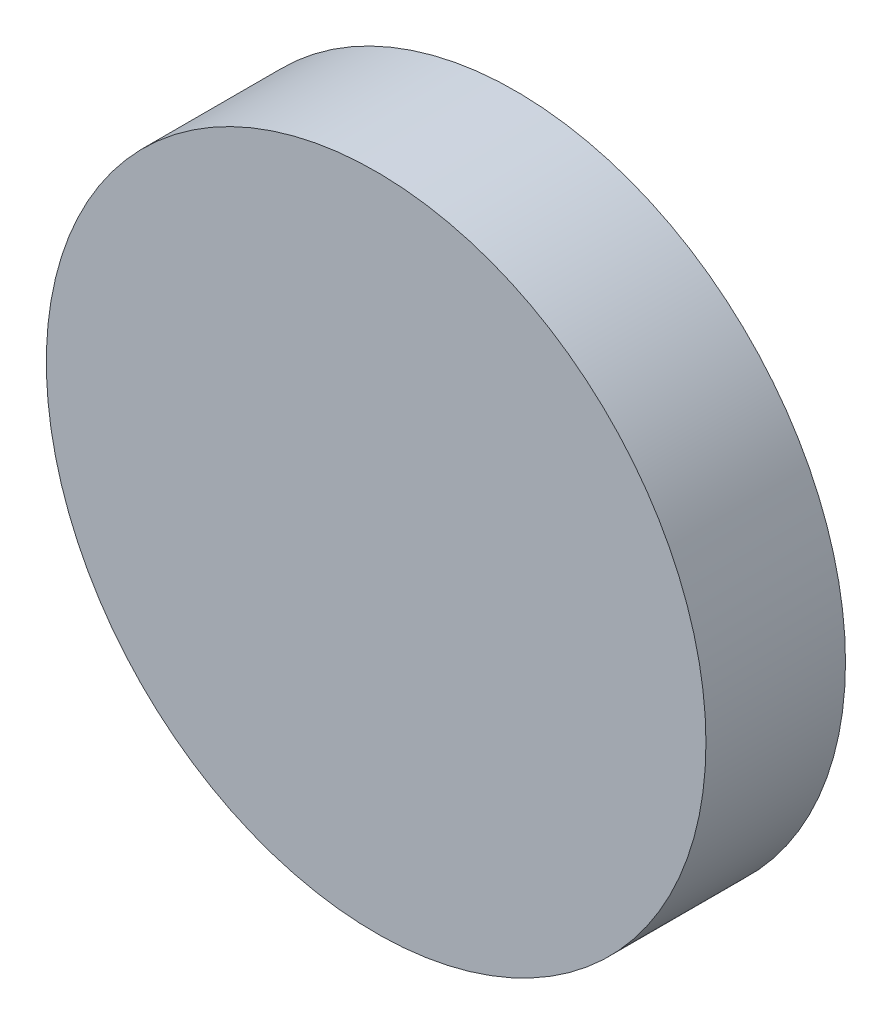
ISO-10303-21;
HEADER;
FILE_DESCRIPTION(('STEP AP214'),'2;1');
FILE_NAME('part.step','',(''),(''),'','','');
FILE_SCHEMA(('AUTOMOTIVE_DESIGN { 1 0 10303 214 1 1 1 1 }'));
ENDSEC;
DATA;
#1=APPLICATION_CONTEXT('core data for automotive mechanical design processes');
#2=APPLICATION_PROTOCOL_DEFINITION('international standard','automotive_design',2000,#1);
#3=PRODUCT_CONTEXT('',#1,'mechanical');
#4=PRODUCT('Part','Part','',(#3));
#5=PRODUCT_RELATED_PRODUCT_CATEGORY('part','',(#4));
#6=PRODUCT_DEFINITION_FORMATION('','',#4);
#7=PRODUCT_DEFINITION_CONTEXT('part definition',#1,'design');
#8=PRODUCT_DEFINITION('design','',#6,#7);
#9=PRODUCT_DEFINITION_SHAPE('','',#8);
#10=(LENGTH_UNIT() NAMED_UNIT(*) SI_UNIT(.MILLI.,.METRE.));
#11=(NAMED_UNIT(*) PLANE_ANGLE_UNIT() SI_UNIT($,.RADIAN.));
#12=(NAMED_UNIT(*) SI_UNIT($,.STERADIAN.) SOLID_ANGLE_UNIT());
#13=UNCERTAINTY_MEASURE_WITH_UNIT(LENGTH_MEASURE(1.E-05),#10,'distance_accuracy_value','');
#14=(GEOMETRIC_REPRESENTATION_CONTEXT(3) GLOBAL_UNCERTAINTY_ASSIGNED_CONTEXT((#13)) GLOBAL_UNIT_ASSIGNED_CONTEXT((#10,
#11,#12)) REPRESENTATION_CONTEXT('',''));
#15=CARTESIAN_POINT('',(0.,0.,0.));
#16=DIRECTION('',(0.,0.,1.));
#17=DIRECTION('',(1.,0.,0.));
#18=AXIS2_PLACEMENT_3D('',#15,#16,#17);
#19=CARTESIAN_POINT('',(0.,0.,33.));
#20=DIRECTION('',(0.,0.,-1.));
#21=DIRECTION('',(-1.,0.,0.));
#22=AXIS2_PLACEMENT_3D('',#19,#20,#21);
#23=CYLINDRICAL_SURFACE('',#22,78.);
#24=CARTESIAN_POINT('',(0.,0.,33.));
#25=DIRECTION('',(0.,0.,1.));
#26=DIRECTION('',(1.,0.,0.));
#27=AXIS2_PLACEMENT_3D('',#24,#25,#26);
#28=CIRCLE('',#27,78.);
#29=CARTESIAN_POINT('',(78.,0.,33.));
#30=VERTEX_POINT('',#29);
#31=EDGE_CURVE('E10',#30,#30,#28,.T.);
#32=ORIENTED_EDGE('',*,*,#31,.F.);
#33=EDGE_LOOP('',(#32));
#34=FACE_BOUND('',#33,.T.);
#35=CARTESIAN_POINT('',(0.,0.,0.));
#36=DIRECTION('',(0.,0.,1.));
#37=DIRECTION('',(1.,0.,0.));
#38=AXIS2_PLACEMENT_3D('',#35,#36,#37);
#39=CIRCLE('',#38,78.);
#40=CARTESIAN_POINT('',(78.,0.,0.));
#41=VERTEX_POINT('',#40);
#42=EDGE_CURVE('E34',#41,#41,#39,.T.);
#43=ORIENTED_EDGE('',*,*,#42,.T.);
#44=EDGE_LOOP('',(#43));
#45=FACE_BOUND('',#44,.T.);
#46=ADVANCED_FACE('F31',(#34,#45),#23,.T.);
#47=CARTESIAN_POINT('',(0.,0.,33.));
#48=DIRECTION('',(0.,0.,1.));
#49=DIRECTION('',(1.,0.,0.));
#50=AXIS2_PLACEMENT_3D('',#47,#48,#49);
#51=PLANE('',#50);
#52=ORIENTED_EDGE('',*,*,#31,.T.);
#53=EDGE_LOOP('',(#52));
#54=FACE_BOUND('',#53,.T.);
#55=ADVANCED_FACE('F46',(#54),#51,.T.);
#56=CARTESIAN_POINT('',(0.,0.,0.));
#57=DIRECTION('',(0.,0.,1.));
#58=DIRECTION('',(1.,0.,0.));
#59=AXIS2_PLACEMENT_3D('',#56,#57,#58);
#60=PLANE('',#59);
#61=ORIENTED_EDGE('',*,*,#42,.F.);
#62=EDGE_LOOP('',(#61));
#63=FACE_BOUND('',#62,.T.);
#64=ADVANCED_FACE('F44',(#63),#60,.F.);
#65=CLOSED_SHELL('',(#46,#55,#64));
#66=MANIFOLD_SOLID_BREP('B2',#65);
#67=ADVANCED_BREP_SHAPE_REPRESENTATION('',(#18,#66),#14);
#68=SHAPE_DEFINITION_REPRESENTATION(#9,#67);
ENDSEC;
END-ISO-10303-21;
